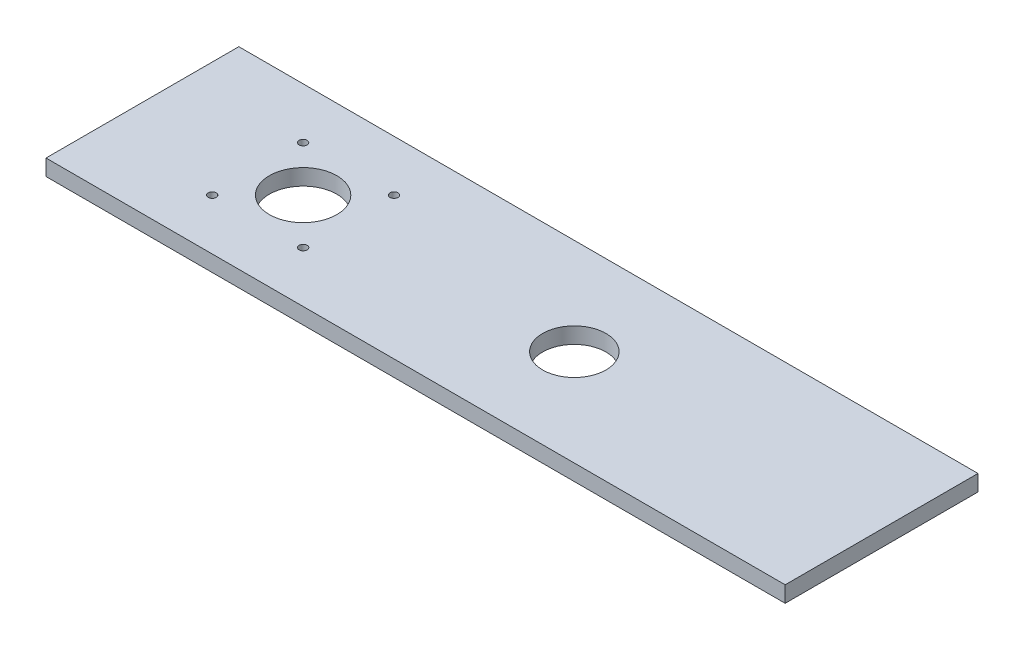
ISO-10303-21;
HEADER;
FILE_DESCRIPTION(('STEP AP214'),'2;1');
FILE_NAME('part.step','',(''),(''),'','','');
FILE_SCHEMA(('AUTOMOTIVE_DESIGN { 1 0 10303 214 1 1 1 1 }'));
ENDSEC;
DATA;
#1=APPLICATION_CONTEXT('core data for automotive mechanical design processes');
#2=APPLICATION_PROTOCOL_DEFINITION('international standard','automotive_design',2000,#1);
#3=PRODUCT_CONTEXT('',#1,'mechanical');
#4=PRODUCT('Part','Part','',(#3));
#5=PRODUCT_RELATED_PRODUCT_CATEGORY('part','',(#4));
#6=PRODUCT_DEFINITION_FORMATION('','',#4);
#7=PRODUCT_DEFINITION_CONTEXT('part definition',#1,'design');
#8=PRODUCT_DEFINITION('design','',#6,#7);
#9=PRODUCT_DEFINITION_SHAPE('','',#8);
#10=(LENGTH_UNIT() NAMED_UNIT(*) SI_UNIT(.MILLI.,.METRE.));
#11=(NAMED_UNIT(*) PLANE_ANGLE_UNIT() SI_UNIT($,.RADIAN.));
#12=(NAMED_UNIT(*) SI_UNIT($,.STERADIAN.) SOLID_ANGLE_UNIT());
#13=UNCERTAINTY_MEASURE_WITH_UNIT(LENGTH_MEASURE(1.E-05),#10,'distance_accuracy_value','');
#14=(GEOMETRIC_REPRESENTATION_CONTEXT(3) GLOBAL_UNCERTAINTY_ASSIGNED_CONTEXT((#13)) GLOBAL_UNIT_ASSIGNED_CONTEXT((#10,
#11,#12)) REPRESENTATION_CONTEXT('',''));
#15=CARTESIAN_POINT('',(0.,0.,0.));
#16=DIRECTION('',(0.,0.,1.));
#17=DIRECTION('',(1.,0.,0.));
#18=AXIS2_PLACEMENT_3D('',#15,#16,#17);
#19=CARTESIAN_POINT('',(0.,5.,0.));
#20=DIRECTION('',(0.,1.,0.));
#21=DIRECTION('',(0.,0.,1.));
#22=AXIS2_PLACEMENT_3D('',#19,#20,#21);
#23=PLANE('',#22);
#24=CARTESIAN_POINT('',(-14.1421356237309,5.,-14.142135623731));
#25=DIRECTION('',(0.,1.,0.));
#26=DIRECTION('',(0.,0.,1.));
#27=AXIS2_PLACEMENT_3D('',#24,#25,#26);
#28=CIRCLE('',#27,1.24999999999999);
#29=CARTESIAN_POINT('',(-14.1421356237309,5.,-12.892135623731));
#30=VERTEX_POINT('',#29);
#31=EDGE_CURVE('E151',#30,#30,#28,.T.);
#32=ORIENTED_EDGE('',*,*,#31,.F.);
#33=EDGE_LOOP('',(#32));
#34=FACE_BOUND('',#33,.T.);
#35=CARTESIAN_POINT('',(14.142135623731,5.,-14.1421356237317));
#36=DIRECTION('',(0.,1.,0.));
#37=DIRECTION('',(0.,0.,1.));
#38=AXIS2_PLACEMENT_3D('',#35,#36,#37);
#39=CIRCLE('',#38,1.24999999999999);
#40=CARTESIAN_POINT('',(14.142135623731,5.,-12.8921356237317));
#41=VERTEX_POINT('',#40);
#42=EDGE_CURVE('E145',#41,#41,#39,.T.);
#43=ORIENTED_EDGE('',*,*,#42,.F.);
#44=EDGE_LOOP('',(#43));
#45=FACE_BOUND('',#44,.T.);
#46=CARTESIAN_POINT('',(14.1421356237317,5.,14.1421356237302));
#47=DIRECTION('',(0.,1.,0.));
#48=DIRECTION('',(0.,0.,1.));
#49=AXIS2_PLACEMENT_3D('',#46,#47,#48);
#50=CIRCLE('',#49,1.24999999999999);
#51=CARTESIAN_POINT('',(14.1421356237317,5.,15.3921356237302));
#52=VERTEX_POINT('',#51);
#53=EDGE_CURVE('E139',#52,#52,#50,.T.);
#54=ORIENTED_EDGE('',*,*,#53,.F.);
#55=EDGE_LOOP('',(#54));
#56=FACE_BOUND('',#55,.T.);
#57=CARTESIAN_POINT('',(-14.1421356237302,5.,14.1421356237309));
#58=DIRECTION('',(0.,1.,0.));
#59=DIRECTION('',(0.,0.,1.));
#60=AXIS2_PLACEMENT_3D('',#57,#58,#59);
#61=CIRCLE('',#60,1.24999999999999);
#62=CARTESIAN_POINT('',(-14.1421356237302,5.,15.3921356237309));
#63=VERTEX_POINT('',#62);
#64=EDGE_CURVE('E133',#63,#63,#61,.T.);
#65=ORIENTED_EDGE('',*,*,#64,.F.);
#66=EDGE_LOOP('',(#65));
#67=FACE_BOUND('',#66,.T.);
#68=CARTESIAN_POINT('',(0.,5.,0.));
#69=DIRECTION('',(0.,1.,0.));
#70=DIRECTION('',(0.,0.,1.));
#71=AXIS2_PLACEMENT_3D('',#68,#69,#70);
#72=CIRCLE('',#71,10.5);
#73=CARTESIAN_POINT('',(0.,5.,10.5));
#74=VERTEX_POINT('',#73);
#75=EDGE_CURVE('E107',#74,#74,#72,.T.);
#76=ORIENTED_EDGE('',*,*,#75,.F.);
#77=EDGE_LOOP('',(#76));
#78=FACE_BOUND('',#77,.T.);
#79=DIRECTION('',(1.,0.,0.));
#80=VECTOR('',#79,1.);
#81=CARTESIAN_POINT('',(180.,5.,30.));
#82=LINE('',#81,#80);
#83=CARTESIAN_POINT('',(-50.,5.,30.));
#84=VERTEX_POINT('',#83);
#85=CARTESIAN_POINT('',(180.,5.,30.));
#86=VERTEX_POINT('',#85);
#87=EDGE_CURVE('E92',#84,#86,#82,.T.);
#88=ORIENTED_EDGE('',*,*,#87,.T.);
#89=DIRECTION('',(0.,0.,-1.));
#90=VECTOR('',#89,1.);
#91=CARTESIAN_POINT('',(180.,5.,-30.));
#92=LINE('',#91,#90);
#93=CARTESIAN_POINT('',(180.,5.,-30.));
#94=VERTEX_POINT('',#93);
#95=EDGE_CURVE('E87',#86,#94,#92,.T.);
#96=ORIENTED_EDGE('',*,*,#95,.T.);
#97=DIRECTION('',(-1.,0.,0.));
#98=VECTOR('',#97,1.);
#99=CARTESIAN_POINT('',(-50.,5.,-29.9999999999999));
#100=LINE('',#99,#98);
#101=CARTESIAN_POINT('',(-50.,5.,-29.9999999999999));
#102=VERTEX_POINT('',#101);
#103=EDGE_CURVE('E90',#94,#102,#100,.T.);
#104=ORIENTED_EDGE('',*,*,#103,.T.);
#105=DIRECTION('',(0.,0.,1.));
#106=VECTOR('',#105,1.);
#107=CARTESIAN_POINT('',(-50.,5.,-29.9999999999999));
#108=LINE('',#107,#106);
#109=EDGE_CURVE('E57',#102,#84,#108,.T.);
#110=ORIENTED_EDGE('',*,*,#109,.T.);
#111=EDGE_LOOP('',(#88,#96,#104,#110));
#112=FACE_BOUND('',#111,.T.);
#113=CARTESIAN_POINT('',(84.3856127895503,5.,0.));
#114=DIRECTION('',(0.,1.,0.));
#115=DIRECTION('',(0.,0.,1.));
#116=AXIS2_PLACEMENT_3D('',#113,#114,#115);
#117=CIRCLE('',#116,9.84832084782724);
#118=CARTESIAN_POINT('',(84.3856127895503,5.,9.84832084782724));
#119=VERTEX_POINT('',#118);
#120=EDGE_CURVE('E122',#119,#119,#117,.T.);
#121=ORIENTED_EDGE('',*,*,#120,.F.);
#122=EDGE_LOOP('',(#121));
#123=FACE_BOUND('',#122,.T.);
#124=ADVANCED_FACE('F40',(#34,#45,#56,#67,#78,#112,#123),#23,.T.);
#125=CARTESIAN_POINT('',(0.,0.,0.));
#126=DIRECTION('',(0.,1.,0.));
#127=DIRECTION('',(0.,0.,1.));
#128=AXIS2_PLACEMENT_3D('',#125,#126,#127);
#129=PLANE('',#128);
#130=CARTESIAN_POINT('',(-14.1421356237309,0.,-14.142135623731));
#131=DIRECTION('',(0.,1.,0.));
#132=DIRECTION('',(0.,0.,1.));
#133=AXIS2_PLACEMENT_3D('',#130,#131,#132);
#134=CIRCLE('',#133,1.25);
#135=CARTESIAN_POINT('',(-14.1421356237309,0.,-12.892135623731));
#136=VERTEX_POINT('',#135);
#137=EDGE_CURVE('E148',#136,#136,#134,.T.);
#138=ORIENTED_EDGE('',*,*,#137,.T.);
#139=EDGE_LOOP('',(#138));
#140=FACE_BOUND('',#139,.T.);
#141=CARTESIAN_POINT('',(14.142135623731,0.,-14.1421356237317));
#142=DIRECTION('',(0.,1.,0.));
#143=DIRECTION('',(0.,0.,1.));
#144=AXIS2_PLACEMENT_3D('',#141,#142,#143);
#145=CIRCLE('',#144,1.25);
#146=CARTESIAN_POINT('',(14.142135623731,0.,-12.8921356237317));
#147=VERTEX_POINT('',#146);
#148=EDGE_CURVE('E142',#147,#147,#145,.T.);
#149=ORIENTED_EDGE('',*,*,#148,.T.);
#150=EDGE_LOOP('',(#149));
#151=FACE_BOUND('',#150,.T.);
#152=CARTESIAN_POINT('',(14.1421356237317,0.,14.1421356237302));
#153=DIRECTION('',(0.,1.,0.));
#154=DIRECTION('',(0.,0.,1.));
#155=AXIS2_PLACEMENT_3D('',#152,#153,#154);
#156=CIRCLE('',#155,1.25);
#157=CARTESIAN_POINT('',(14.1421356237317,0.,15.3921356237302));
#158=VERTEX_POINT('',#157);
#159=EDGE_CURVE('E136',#158,#158,#156,.T.);
#160=ORIENTED_EDGE('',*,*,#159,.T.);
#161=EDGE_LOOP('',(#160));
#162=FACE_BOUND('',#161,.T.);
#163=CARTESIAN_POINT('',(-14.1421356237302,0.,14.1421356237309));
#164=DIRECTION('',(0.,1.,0.));
#165=DIRECTION('',(0.,0.,1.));
#166=AXIS2_PLACEMENT_3D('',#163,#164,#165);
#167=CIRCLE('',#166,1.25);
#168=CARTESIAN_POINT('',(-14.1421356237302,0.,15.3921356237309));
#169=VERTEX_POINT('',#168);
#170=EDGE_CURVE('E128',#169,#169,#167,.T.);
#171=ORIENTED_EDGE('',*,*,#170,.T.);
#172=EDGE_LOOP('',(#171));
#173=FACE_BOUND('',#172,.T.);
#174=DIRECTION('',(1.,0.,0.));
#175=VECTOR('',#174,1.);
#176=CARTESIAN_POINT('',(180.,0.,30.));
#177=LINE('',#176,#175);
#178=CARTESIAN_POINT('',(-50.,0.,30.));
#179=VERTEX_POINT('',#178);
#180=CARTESIAN_POINT('',(180.,0.,30.));
#181=VERTEX_POINT('',#180);
#182=EDGE_CURVE('E104',#179,#181,#177,.T.);
#183=ORIENTED_EDGE('',*,*,#182,.F.);
#184=DIRECTION('',(0.,0.,1.));
#185=VECTOR('',#184,1.);
#186=CARTESIAN_POINT('',(-50.,0.,-29.9999999999999));
#187=LINE('',#186,#185);
#188=CARTESIAN_POINT('',(-50.,0.,-29.9999999999999));
#189=VERTEX_POINT('',#188);
#190=EDGE_CURVE('E80',#189,#179,#187,.T.);
#191=ORIENTED_EDGE('',*,*,#190,.F.);
#192=DIRECTION('',(-1.,0.,0.));
#193=VECTOR('',#192,1.);
#194=CARTESIAN_POINT('',(-50.,0.,-29.9999999999999));
#195=LINE('',#194,#193);
#196=CARTESIAN_POINT('',(180.,0.,-30.));
#197=VERTEX_POINT('',#196);
#198=EDGE_CURVE('E74',#197,#189,#195,.T.);
#199=ORIENTED_EDGE('',*,*,#198,.F.);
#200=DIRECTION('',(0.,0.,-1.));
#201=VECTOR('',#200,1.);
#202=CARTESIAN_POINT('',(180.,0.,-30.));
#203=LINE('',#202,#201);
#204=EDGE_CURVE('E96',#181,#197,#203,.T.);
#205=ORIENTED_EDGE('',*,*,#204,.F.);
#206=EDGE_LOOP('',(#183,#191,#199,#205));
#207=FACE_BOUND('',#206,.T.);
#208=CARTESIAN_POINT('',(0.,0.,0.));
#209=DIRECTION('',(0.,1.,0.));
#210=DIRECTION('',(0.,0.,1.));
#211=AXIS2_PLACEMENT_3D('',#208,#209,#210);
#212=CIRCLE('',#211,10.5);
#213=CARTESIAN_POINT('',(0.,0.,10.5));
#214=VERTEX_POINT('',#213);
#215=EDGE_CURVE('E119',#214,#214,#212,.T.);
#216=ORIENTED_EDGE('',*,*,#215,.T.);
#217=EDGE_LOOP('',(#216));
#218=FACE_BOUND('',#217,.T.);
#219=CARTESIAN_POINT('',(84.3856127895503,0.,0.));
#220=DIRECTION('',(0.,1.,0.));
#221=DIRECTION('',(0.,0.,1.));
#222=AXIS2_PLACEMENT_3D('',#219,#220,#221);
#223=CIRCLE('',#222,9.84832084782724);
#224=CARTESIAN_POINT('',(84.3856127895503,0.,9.84832084782724));
#225=VERTEX_POINT('',#224);
#226=EDGE_CURVE('E125',#225,#225,#223,.T.);
#227=ORIENTED_EDGE('',*,*,#226,.T.);
#228=EDGE_LOOP('',(#227));
#229=FACE_BOUND('',#228,.T.);
#230=ADVANCED_FACE('F115',(#140,#151,#162,#173,#207,#218,#229),#129,.F.);
#231=CARTESIAN_POINT('',(180.,5.,30.));
#232=DIRECTION('',(0.,0.,-1.));
#233=DIRECTION('',(-1.,0.,0.));
#234=AXIS2_PLACEMENT_3D('',#231,#232,#233);
#235=PLANE('',#234);
#236=ORIENTED_EDGE('',*,*,#182,.T.);
#237=DIRECTION('',(0.,-1.,0.));
#238=VECTOR('',#237,1.);
#239=CARTESIAN_POINT('',(180.,5.,30.));
#240=LINE('',#239,#238);
#241=EDGE_CURVE('E11',#86,#181,#240,.T.);
#242=ORIENTED_EDGE('',*,*,#241,.F.);
#243=ORIENTED_EDGE('',*,*,#87,.F.);
#244=DIRECTION('',(0.,-1.,0.));
#245=VECTOR('',#244,1.);
#246=CARTESIAN_POINT('',(-50.,5.,30.));
#247=LINE('',#246,#245);
#248=EDGE_CURVE('E100',#84,#179,#247,.T.);
#249=ORIENTED_EDGE('',*,*,#248,.T.);
#250=EDGE_LOOP('',(#236,#242,#243,#249));
#251=FACE_BOUND('',#250,.T.);
#252=ADVANCED_FACE('F42',(#251),#235,.F.);
#253=CARTESIAN_POINT('',(180.,5.,-30.));
#254=DIRECTION('',(-1.,0.,0.));
#255=DIRECTION('',(0.,0.,1.));
#256=AXIS2_PLACEMENT_3D('',#253,#254,#255);
#257=PLANE('',#256);
#258=ORIENTED_EDGE('',*,*,#204,.T.);
#259=DIRECTION('',(0.,-1.,0.));
#260=VECTOR('',#259,1.);
#261=CARTESIAN_POINT('',(180.,5.,-30.));
#262=LINE('',#261,#260);
#263=EDGE_CURVE('E49',#94,#197,#262,.T.);
#264=ORIENTED_EDGE('',*,*,#263,.F.);
#265=ORIENTED_EDGE('',*,*,#95,.F.);
#266=ORIENTED_EDGE('',*,*,#241,.T.);
#267=EDGE_LOOP('',(#258,#264,#265,#266));
#268=FACE_BOUND('',#267,.T.);
#269=ADVANCED_FACE('F95',(#268),#257,.F.);
#270=CARTESIAN_POINT('',(-50.,5.,-29.9999999999999));
#271=DIRECTION('',(0.,0.,1.));
#272=DIRECTION('',(1.,0.,0.));
#273=AXIS2_PLACEMENT_3D('',#270,#271,#272);
#274=PLANE('',#273);
#275=ORIENTED_EDGE('',*,*,#198,.T.);
#276=DIRECTION('',(0.,-1.,0.));
#277=VECTOR('',#276,1.);
#278=CARTESIAN_POINT('',(-50.,5.,-29.9999999999999));
#279=LINE('',#278,#277);
#280=EDGE_CURVE('E97',#102,#189,#279,.T.);
#281=ORIENTED_EDGE('',*,*,#280,.F.);
#282=ORIENTED_EDGE('',*,*,#103,.F.);
#283=ORIENTED_EDGE('',*,*,#263,.T.);
#284=EDGE_LOOP('',(#275,#281,#282,#283));
#285=FACE_BOUND('',#284,.T.);
#286=ADVANCED_FACE('F98',(#285),#274,.F.);
#287=CARTESIAN_POINT('',(-50.,5.,-29.9999999999999));
#288=DIRECTION('',(1.,0.,0.));
#289=DIRECTION('',(0.,0.,-1.));
#290=AXIS2_PLACEMENT_3D('',#287,#288,#289);
#291=PLANE('',#290);
#292=ORIENTED_EDGE('',*,*,#190,.T.);
#293=ORIENTED_EDGE('',*,*,#248,.F.);
#294=ORIENTED_EDGE('',*,*,#109,.F.);
#295=ORIENTED_EDGE('',*,*,#280,.T.);
#296=EDGE_LOOP('',(#292,#293,#294,#295));
#297=FACE_BOUND('',#296,.T.);
#298=ADVANCED_FACE('F112',(#297),#291,.F.);
#299=CARTESIAN_POINT('',(0.,5.,0.));
#300=DIRECTION('',(0.,-1.,0.));
#301=DIRECTION('',(0.,0.,-1.));
#302=AXIS2_PLACEMENT_3D('',#299,#300,#301);
#303=CYLINDRICAL_SURFACE('',#302,10.5);
#304=ORIENTED_EDGE('',*,*,#75,.T.);
#305=EDGE_LOOP('',(#304));
#306=FACE_BOUND('',#305,.T.);
#307=ORIENTED_EDGE('',*,*,#215,.F.);
#308=EDGE_LOOP('',(#307));
#309=FACE_BOUND('',#308,.T.);
#310=ADVANCED_FACE('F168',(#306,#309),#303,.F.);
#311=CARTESIAN_POINT('',(84.3856127895503,5.,0.));
#312=DIRECTION('',(0.,-1.,0.));
#313=DIRECTION('',(0.,0.,-1.));
#314=AXIS2_PLACEMENT_3D('',#311,#312,#313);
#315=CYLINDRICAL_SURFACE('',#314,9.84832084782724);
#316=ORIENTED_EDGE('',*,*,#120,.T.);
#317=EDGE_LOOP('',(#316));
#318=FACE_BOUND('',#317,.T.);
#319=ORIENTED_EDGE('',*,*,#226,.F.);
#320=EDGE_LOOP('',(#319));
#321=FACE_BOUND('',#320,.T.);
#322=ADVANCED_FACE('F171',(#318,#321),#315,.F.);
#323=CARTESIAN_POINT('',(-14.1421356237302,5.,14.1421356237309));
#324=DIRECTION('',(0.,1.,0.));
#325=DIRECTION('',(0.,0.,1.));
#326=AXIS2_PLACEMENT_3D('',#323,#324,#325);
#327=CYLINDRICAL_SURFACE('',#326,1.24999999999999);
#328=ORIENTED_EDGE('',*,*,#170,.F.);
#329=EDGE_LOOP('',(#328));
#330=FACE_BOUND('',#329,.T.);
#331=ORIENTED_EDGE('',*,*,#64,.T.);
#332=EDGE_LOOP('',(#331));
#333=FACE_BOUND('',#332,.T.);
#334=ADVANCED_FACE('F181',(#330,#333),#327,.F.);
#335=CARTESIAN_POINT('',(14.1421356237317,5.,14.1421356237302));
#336=DIRECTION('',(0.,1.,0.));
#337=DIRECTION('',(0.,0.,1.));
#338=AXIS2_PLACEMENT_3D('',#335,#336,#337);
#339=CYLINDRICAL_SURFACE('',#338,1.24999999999999);
#340=ORIENTED_EDGE('',*,*,#159,.F.);
#341=EDGE_LOOP('',(#340));
#342=FACE_BOUND('',#341,.T.);
#343=ORIENTED_EDGE('',*,*,#53,.T.);
#344=EDGE_LOOP('',(#343));
#345=FACE_BOUND('',#344,.T.);
#346=ADVANCED_FACE('F187',(#342,#345),#339,.F.);
#347=CARTESIAN_POINT('',(14.142135623731,5.,-14.1421356237317));
#348=DIRECTION('',(0.,1.,0.));
#349=DIRECTION('',(0.,0.,1.));
#350=AXIS2_PLACEMENT_3D('',#347,#348,#349);
#351=CYLINDRICAL_SURFACE('',#350,1.24999999999999);
#352=ORIENTED_EDGE('',*,*,#148,.F.);
#353=EDGE_LOOP('',(#352));
#354=FACE_BOUND('',#353,.T.);
#355=ORIENTED_EDGE('',*,*,#42,.T.);
#356=EDGE_LOOP('',(#355));
#357=FACE_BOUND('',#356,.T.);
#358=ADVANCED_FACE('F220',(#354,#357),#351,.F.);
#359=CARTESIAN_POINT('',(-14.1421356237309,5.,-14.142135623731));
#360=DIRECTION('',(0.,1.,0.));
#361=DIRECTION('',(0.,0.,1.));
#362=AXIS2_PLACEMENT_3D('',#359,#360,#361);
#363=CYLINDRICAL_SURFACE('',#362,1.24999999999999);
#364=ORIENTED_EDGE('',*,*,#137,.F.);
#365=EDGE_LOOP('',(#364));
#366=FACE_BOUND('',#365,.T.);
#367=ORIENTED_EDGE('',*,*,#31,.T.);
#368=EDGE_LOOP('',(#367));
#369=FACE_BOUND('',#368,.T.);
#370=ADVANCED_FACE('F155',(#366,#369),#363,.F.);
#371=CLOSED_SHELL('',(#124,#230,#252,#269,#286,#298,#310,#322,#334,#346,#358,#370));
#372=MANIFOLD_SOLID_BREP('B2',#371);
#373=ADVANCED_BREP_SHAPE_REPRESENTATION('',(#18,#372),#14);
#374=SHAPE_DEFINITION_REPRESENTATION(#9,#373);
ENDSEC;
END-ISO-10303-21;
